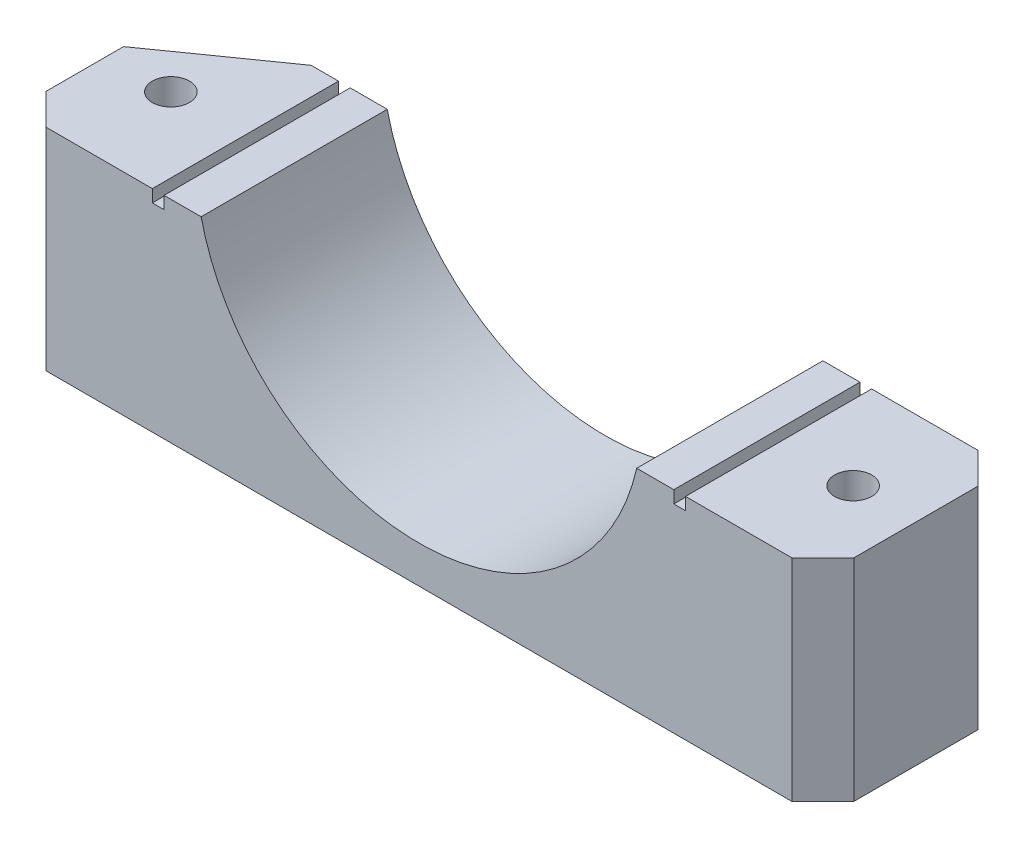
ISO-10303-21;
HEADER;
FILE_DESCRIPTION(('STEP AP214'),'2;1');
FILE_NAME('part.step','',(''),(''),'','','');
FILE_SCHEMA(('AUTOMOTIVE_DESIGN { 1 0 10303 214 1 1 1 1 }'));
ENDSEC;
DATA;
#1=APPLICATION_CONTEXT('core data for automotive mechanical design processes');
#2=APPLICATION_PROTOCOL_DEFINITION('international standard','automotive_design',2000,#1);
#3=PRODUCT_CONTEXT('',#1,'mechanical');
#4=PRODUCT('Part','Part','',(#3));
#5=PRODUCT_RELATED_PRODUCT_CATEGORY('part','',(#4));
#6=PRODUCT_DEFINITION_FORMATION('','',#4);
#7=PRODUCT_DEFINITION_CONTEXT('part definition',#1,'design');
#8=PRODUCT_DEFINITION('design','',#6,#7);
#9=PRODUCT_DEFINITION_SHAPE('','',#8);
#10=(LENGTH_UNIT() NAMED_UNIT(*) SI_UNIT(.MILLI.,.METRE.));
#11=(NAMED_UNIT(*) PLANE_ANGLE_UNIT() SI_UNIT($,.RADIAN.));
#12=(NAMED_UNIT(*) SI_UNIT($,.STERADIAN.) SOLID_ANGLE_UNIT());
#13=UNCERTAINTY_MEASURE_WITH_UNIT(LENGTH_MEASURE(1.E-05),#10,'distance_accuracy_value','');
#14=(GEOMETRIC_REPRESENTATION_CONTEXT(3) GLOBAL_UNCERTAINTY_ASSIGNED_CONTEXT((#13)) GLOBAL_UNIT_ASSIGNED_CONTEXT((#10,
#11,#12)) REPRESENTATION_CONTEXT('',''));
#15=CARTESIAN_POINT('',(0.,0.,0.));
#16=DIRECTION('',(0.,0.,1.));
#17=DIRECTION('',(1.,0.,0.));
#18=AXIS2_PLACEMENT_3D('',#15,#16,#17);
#19=CARTESIAN_POINT('',(32.5499287747842,-4.,15.));
#20=DIRECTION('',(0.,-1.,0.));
#21=DIRECTION('',(1.,0.,0.));
#22=AXIS2_PLACEMENT_3D('',#19,#20,#21);
#23=PLANE('',#22);
#24=CARTESIAN_POINT('',(27.4886444805463,-4.,7.50000000000003));
#25=DIRECTION('',(0.,1.,0.));
#26=DIRECTION('',(-1.,0.,0.));
#27=AXIS2_PLACEMENT_3D('',#24,#25,#26);
#28=CIRCLE('',#27,1.5);
#29=CARTESIAN_POINT('',(25.9886444805463,-4.,7.50000000000003));
#30=VERTEX_POINT('',#29);
#31=EDGE_CURVE('E294',#30,#30,#28,.T.);
#32=ORIENTED_EDGE('',*,*,#31,.F.);
#33=EDGE_LOOP('',(#32));
#34=FACE_BOUND('',#33,.T.);
#35=DIRECTION('',(0.,0.,1.));
#36=VECTOR('',#35,1.);
#37=CARTESIAN_POINT('',(21.4797362047984,-4.,0.));
#38=LINE('',#37,#36);
#39=CARTESIAN_POINT('',(21.4797362047984,-4.,0.));
#40=VERTEX_POINT('',#39);
#41=CARTESIAN_POINT('',(21.4797362047984,-4.,15.));
#42=VERTEX_POINT('',#41);
#43=EDGE_CURVE('E408',#40,#42,#38,.T.);
#44=ORIENTED_EDGE('',*,*,#43,.T.);
#45=DIRECTION('',(-1.,0.,0.));
#46=VECTOR('',#45,1.);
#47=CARTESIAN_POINT('',(32.5499287747842,-4.,15.));
#48=LINE('',#47,#46);
#49=CARTESIAN_POINT('',(30.0499287747842,-4.,15.));
#50=VERTEX_POINT('',#49);
#51=EDGE_CURVE('E192',#50,#42,#48,.T.);
#52=ORIENTED_EDGE('',*,*,#51,.F.);
#53=DIRECTION('',(0.707106781186548,0.,-0.707106781186548));
#54=VECTOR('',#53,1.);
#55=CARTESIAN_POINT('',(30.0499287747842,-4.,15.));
#56=LINE('',#55,#54);
#57=CARTESIAN_POINT('',(32.5499287747842,-4.,12.5));
#58=VERTEX_POINT('',#57);
#59=EDGE_CURVE('E220',#50,#58,#56,.T.);
#60=ORIENTED_EDGE('',*,*,#59,.T.);
#61=DIRECTION('',(0.,0.,-1.));
#62=VECTOR('',#61,1.);
#63=CARTESIAN_POINT('',(32.5499287747842,-4.,15.));
#64=LINE('',#63,#62);
#65=CARTESIAN_POINT('',(32.5499287747842,-4.,2.5));
#66=VERTEX_POINT('',#65);
#67=EDGE_CURVE('E212',#58,#66,#64,.T.);
#68=ORIENTED_EDGE('',*,*,#67,.T.);
#69=DIRECTION('',(0.707106781186548,0.,0.707106781186547));
#70=VECTOR('',#69,1.);
#71=CARTESIAN_POINT('',(32.5499287747842,-4.,2.5));
#72=LINE('',#71,#70);
#73=CARTESIAN_POINT('',(30.0499287747842,-4.,0.));
#74=VERTEX_POINT('',#73);
#75=EDGE_CURVE('E222',#66,#74,#72,.F.);
#76=ORIENTED_EDGE('',*,*,#75,.T.);
#77=DIRECTION('',(-1.,0.,0.));
#78=VECTOR('',#77,1.);
#79=CARTESIAN_POINT('',(32.5499287747842,-4.,0.));
#80=LINE('',#79,#78);
#81=EDGE_CURVE('E264',#74,#40,#80,.T.);
#82=ORIENTED_EDGE('',*,*,#81,.T.);
#83=EDGE_LOOP('',(#44,#52,#60,#68,#76,#82));
#84=FACE_BOUND('',#83,.T.);
#85=ADVANCED_FACE('F45',(#34,#84),#23,.F.);
#86=CARTESIAN_POINT('',(-17.5499287747842,-4.,15.));
#87=DIRECTION('',(0.,-1.,0.));
#88=DIRECTION('',(1.,0.,0.));
#89=AXIS2_PLACEMENT_3D('',#86,#87,#88);
#90=PLANE('',#89);
#91=DIRECTION('',(0.,0.,1.));
#92=VECTOR('',#91,1.);
#93=CARTESIAN_POINT('',(-20.5370518572524,-4.,0.));
#94=LINE('',#93,#92);
#95=CARTESIAN_POINT('',(-20.5370518572524,-4.,0.));
#96=VERTEX_POINT('',#95);
#97=CARTESIAN_POINT('',(-20.5370518572524,-4.,15.));
#98=VERTEX_POINT('',#97);
#99=EDGE_CURVE('E326',#96,#98,#94,.T.);
#100=ORIENTED_EDGE('',*,*,#99,.T.);
#101=DIRECTION('',(-1.,0.,0.));
#102=VECTOR('',#101,1.);
#103=CARTESIAN_POINT('',(-17.5499287747842,-4.,15.));
#104=LINE('',#103,#102);
#105=CARTESIAN_POINT('',(-17.5499287747842,-4.,15.));
#106=VERTEX_POINT('',#105);
#107=EDGE_CURVE('E258',#106,#98,#104,.T.);
#108=ORIENTED_EDGE('',*,*,#107,.F.);
#109=DIRECTION('',(0.,0.,-1.));
#110=VECTOR('',#109,1.);
#111=CARTESIAN_POINT('',(-17.5499287747842,-4.,15.));
#112=LINE('',#111,#110);
#113=CARTESIAN_POINT('',(-17.5499287747842,-4.,0.));
#114=VERTEX_POINT('',#113);
#115=EDGE_CURVE('E207',#106,#114,#112,.T.);
#116=ORIENTED_EDGE('',*,*,#115,.T.);
#117=DIRECTION('',(-1.,0.,0.));
#118=VECTOR('',#117,1.);
#119=CARTESIAN_POINT('',(-17.5499287747842,-4.,0.));
#120=LINE('',#119,#118);
#121=EDGE_CURVE('E190',#114,#96,#120,.T.);
#122=ORIENTED_EDGE('',*,*,#121,.T.);
#123=EDGE_LOOP('',(#100,#108,#116,#122));
#124=FACE_BOUND('',#123,.T.);
#125=ADVANCED_FACE('F351',(#124),#90,.F.);
#126=CARTESIAN_POINT('',(32.5499287747842,-21.,15.));
#127=DIRECTION('',(-1.,0.,0.));
#128=DIRECTION('',(0.,0.,1.));
#129=AXIS2_PLACEMENT_3D('',#126,#127,#128);
#130=PLANE('',#129);
#131=DIRECTION('',(0.,0.,-1.));
#132=VECTOR('',#131,1.);
#133=CARTESIAN_POINT('',(32.5499287747842,-21.,15.));
#134=LINE('',#133,#132);
#135=CARTESIAN_POINT('',(32.5499287747842,-21.,12.5));
#136=VERTEX_POINT('',#135);
#137=CARTESIAN_POINT('',(32.5499287747842,-21.,2.5));
#138=VERTEX_POINT('',#137);
#139=EDGE_CURVE('E199',#136,#138,#134,.T.);
#140=ORIENTED_EDGE('',*,*,#139,.T.);
#141=DIRECTION('',(0.,1.,0.));
#142=VECTOR('',#141,1.);
#143=CARTESIAN_POINT('',(32.5499287747842,-21.,2.5));
#144=LINE('',#143,#142);
#145=EDGE_CURVE('E217',#138,#66,#144,.T.);
#146=ORIENTED_EDGE('',*,*,#145,.T.);
#147=ORIENTED_EDGE('',*,*,#67,.F.);
#148=DIRECTION('',(0.,-1.,0.));
#149=VECTOR('',#148,1.);
#150=CARTESIAN_POINT('',(32.5499287747842,-21.,12.5));
#151=LINE('',#150,#149);
#152=EDGE_CURVE('E215',#58,#136,#151,.T.);
#153=ORIENTED_EDGE('',*,*,#152,.T.);
#154=EDGE_LOOP('',(#140,#146,#147,#153));
#155=FACE_BOUND('',#154,.T.);
#156=ADVANCED_FACE('F353',(#155),#130,.F.);
#157=CARTESIAN_POINT('',(20.5370518572524,-4.,15.));
#158=VERTEX_POINT('',#157);
#159=CARTESIAN_POINT('',(17.5499287747842,-4.,15.));
#160=VERTEX_POINT('',#159);
#161=EDGE_CURVE('E189',#158,#160,#48,.T.);
#162=ORIENTED_EDGE('',*,*,#161,.F.);
#163=DIRECTION('',(0.,0.,1.));
#164=VECTOR('',#163,1.);
#165=CARTESIAN_POINT('',(20.5370518572524,-4.,0.));
#166=LINE('',#165,#164);
#167=CARTESIAN_POINT('',(20.5370518572524,-4.,0.));
#168=VERTEX_POINT('',#167);
#169=EDGE_CURVE('E316',#168,#158,#166,.T.);
#170=ORIENTED_EDGE('',*,*,#169,.F.);
#171=CARTESIAN_POINT('',(17.5499287747842,-4.,0.));
#172=VERTEX_POINT('',#171);
#173=EDGE_CURVE('E267',#168,#172,#80,.T.);
#174=ORIENTED_EDGE('',*,*,#173,.T.);
#175=DIRECTION('',(0.,0.,-1.));
#176=VECTOR('',#175,1.);
#177=CARTESIAN_POINT('',(17.5499287747842,-4.,15.));
#178=LINE('',#177,#176);
#179=EDGE_CURVE('E209',#160,#172,#178,.T.);
#180=ORIENTED_EDGE('',*,*,#179,.F.);
#181=EDGE_LOOP('',(#162,#170,#174,#180));
#182=FACE_BOUND('',#181,.T.);
#183=ADVANCED_FACE('F315',(#182),#23,.F.);
#184=CARTESIAN_POINT('',(0.,0.,15.));
#185=DIRECTION('',(0.,0.,-1.));
#186=DIRECTION('',(-1.,0.,0.));
#187=AXIS2_PLACEMENT_3D('',#184,#185,#186);
#188=CYLINDRICAL_SURFACE('',#187,18.);
#189=CARTESIAN_POINT('',(0.,0.,0.));
#190=DIRECTION('',(0.,0.,1.));
#191=DIRECTION('',(1.,0.,0.));
#192=AXIS2_PLACEMENT_3D('',#189,#190,#191);
#193=CIRCLE('',#192,18.);
#194=EDGE_CURVE('E266',#114,#172,#193,.T.);
#195=ORIENTED_EDGE('',*,*,#194,.F.);
#196=ORIENTED_EDGE('',*,*,#115,.F.);
#197=CARTESIAN_POINT('',(0.,0.,15.));
#198=DIRECTION('',(0.,0.,1.));
#199=DIRECTION('',(1.,0.,0.));
#200=AXIS2_PLACEMENT_3D('',#197,#198,#199);
#201=CIRCLE('',#200,18.);
#202=EDGE_CURVE('E302',#106,#160,#201,.T.);
#203=ORIENTED_EDGE('',*,*,#202,.T.);
#204=ORIENTED_EDGE('',*,*,#179,.T.);
#205=EDGE_LOOP('',(#195,#196,#203,#204));
#206=FACE_BOUND('',#205,.T.);
#207=ADVANCED_FACE('F306',(#206),#188,.F.);
#208=CARTESIAN_POINT('',(-27.4886444805463,-4.00000000000002,7.50000000000003));
#209=DIRECTION('',(0.,1.,0.));
#210=DIRECTION('',(1.,0.,0.));
#211=AXIS2_PLACEMENT_3D('',#208,#209,#210);
#212=CIRCLE('',#211,1.5);
#213=CARTESIAN_POINT('',(-25.9886444805463,-4.00000000000002,7.50000000000003));
#214=VERTEX_POINT('',#213);
#215=EDGE_CURVE('E297',#214,#214,#212,.T.);
#216=ORIENTED_EDGE('',*,*,#215,.F.);
#217=EDGE_LOOP('',(#216));
#218=FACE_BOUND('',#217,.T.);
#219=CARTESIAN_POINT('',(-21.4797362047984,-4.,0.));
#220=VERTEX_POINT('',#219);
#221=CARTESIAN_POINT('',(-23.6830969203936,-4.,0.));
#222=VERTEX_POINT('',#221);
#223=EDGE_CURVE('E195',#220,#222,#120,.T.);
#224=ORIENTED_EDGE('',*,*,#223,.T.);
#225=DIRECTION('',(-0.817355943758289,0.,0.576133023878164));
#226=VECTOR('',#225,1.);
#227=CARTESIAN_POINT('',(-26.6492930181239,-4.,2.09079476359242));
#228=LINE('',#227,#226);
#229=CARTESIAN_POINT('',(-32.5499287747842,-4.,6.25));
#230=VERTEX_POINT('',#229);
#231=EDGE_CURVE('E61',#222,#230,#228,.T.);
#232=ORIENTED_EDGE('',*,*,#231,.T.);
#233=DIRECTION('',(0.,0.,-1.));
#234=VECTOR('',#233,1.);
#235=CARTESIAN_POINT('',(-32.5499287747842,-4.,15.));
#236=LINE('',#235,#234);
#237=CARTESIAN_POINT('',(-32.5499287747842,-4.,12.5));
#238=VERTEX_POINT('',#237);
#239=EDGE_CURVE('E204',#238,#230,#236,.T.);
#240=ORIENTED_EDGE('',*,*,#239,.F.);
#241=DIRECTION('',(0.707106781186548,0.,0.707106781186548));
#242=VECTOR('',#241,1.);
#243=CARTESIAN_POINT('',(-30.0499287747842,-4.,15.));
#244=LINE('',#243,#242);
#245=CARTESIAN_POINT('',(-30.0499287747842,-4.,15.));
#246=VERTEX_POINT('',#245);
#247=EDGE_CURVE('E54',#238,#246,#244,.T.);
#248=ORIENTED_EDGE('',*,*,#247,.T.);
#249=CARTESIAN_POINT('',(-21.4797362047984,-4.,15.));
#250=VERTEX_POINT('',#249);
#251=EDGE_CURVE('E246',#250,#246,#104,.T.);
#252=ORIENTED_EDGE('',*,*,#251,.F.);
#253=DIRECTION('',(0.,0.,1.));
#254=VECTOR('',#253,1.);
#255=CARTESIAN_POINT('',(-21.4797362047984,-4.,0.));
#256=LINE('',#255,#254);
#257=EDGE_CURVE('E272',#220,#250,#256,.T.);
#258=ORIENTED_EDGE('',*,*,#257,.F.);
#259=EDGE_LOOP('',(#224,#232,#240,#248,#252,#258));
#260=FACE_BOUND('',#259,.T.);
#261=ADVANCED_FACE('F244',(#218,#260),#90,.F.);
#262=CARTESIAN_POINT('',(-32.5499287747842,-4.,15.));
#263=DIRECTION('',(1.,0.,0.));
#264=DIRECTION('',(0.,0.,-1.));
#265=AXIS2_PLACEMENT_3D('',#262,#263,#264);
#266=PLANE('',#265);
#267=ORIENTED_EDGE('',*,*,#239,.T.);
#268=DIRECTION('',(0.,-1.,0.));
#269=VECTOR('',#268,1.);
#270=CARTESIAN_POINT('',(-32.5499287747842,3.99999999999999,6.25));
#271=LINE('',#270,#269);
#272=CARTESIAN_POINT('',(-32.5499287747842,-21.,6.25));
#273=VERTEX_POINT('',#272);
#274=EDGE_CURVE('E182',#230,#273,#271,.T.);
#275=ORIENTED_EDGE('',*,*,#274,.T.);
#276=DIRECTION('',(0.,0.,-1.));
#277=VECTOR('',#276,1.);
#278=CARTESIAN_POINT('',(-32.5499287747842,-21.,15.));
#279=LINE('',#278,#277);
#280=CARTESIAN_POINT('',(-32.5499287747842,-21.,12.5));
#281=VERTEX_POINT('',#280);
#282=EDGE_CURVE('E181',#281,#273,#279,.T.);
#283=ORIENTED_EDGE('',*,*,#282,.F.);
#284=DIRECTION('',(0.,1.,0.));
#285=VECTOR('',#284,1.);
#286=CARTESIAN_POINT('',(-32.5499287747842,-4.,12.5));
#287=LINE('',#286,#285);
#288=EDGE_CURVE('E237',#281,#238,#287,.T.);
#289=ORIENTED_EDGE('',*,*,#288,.T.);
#290=EDGE_LOOP('',(#267,#275,#283,#289));
#291=FACE_BOUND('',#290,.T.);
#292=ADVANCED_FACE('F368',(#291),#266,.F.);
#293=CARTESIAN_POINT('',(-32.5499287747842,-21.,15.));
#294=DIRECTION('',(0.,1.,0.));
#295=DIRECTION('',(0.,0.,1.));
#296=AXIS2_PLACEMENT_3D('',#293,#294,#295);
#297=PLANE('',#296);
#298=CARTESIAN_POINT('',(27.4886444805463,-21.,7.50000000000003));
#299=DIRECTION('',(0.,1.,0.));
#300=DIRECTION('',(-1.,0.,0.));
#301=AXIS2_PLACEMENT_3D('',#298,#299,#300);
#302=CIRCLE('',#301,1.5);
#303=CARTESIAN_POINT('',(25.9886444805463,-21.,7.50000000000003));
#304=VERTEX_POINT('',#303);
#305=EDGE_CURVE('E291',#304,#304,#302,.T.);
#306=ORIENTED_EDGE('',*,*,#305,.T.);
#307=EDGE_LOOP('',(#306));
#308=FACE_BOUND('',#307,.T.);
#309=CARTESIAN_POINT('',(-27.4886444805463,-21.,7.50000000000003));
#310=DIRECTION('',(0.,1.,0.));
#311=DIRECTION('',(1.,0.,0.));
#312=AXIS2_PLACEMENT_3D('',#309,#310,#311);
#313=CIRCLE('',#312,1.5);
#314=CARTESIAN_POINT('',(-25.9886444805463,-21.,7.50000000000003));
#315=VERTEX_POINT('',#314);
#316=EDGE_CURVE('E283',#315,#315,#313,.T.);
#317=ORIENTED_EDGE('',*,*,#316,.T.);
#318=EDGE_LOOP('',(#317));
#319=FACE_BOUND('',#318,.T.);
#320=ORIENTED_EDGE('',*,*,#282,.T.);
#321=DIRECTION('',(-0.817355943758289,0.,0.576133023878164));
#322=VECTOR('',#321,1.);
#323=CARTESIAN_POINT('',(-23.6830969203936,-21.,0.));
#324=LINE('',#323,#322);
#325=CARTESIAN_POINT('',(-23.6830969203936,-21.,0.));
#326=VERTEX_POINT('',#325);
#327=EDGE_CURVE('E169',#326,#273,#324,.T.);
#328=ORIENTED_EDGE('',*,*,#327,.F.);
#329=DIRECTION('',(1.,0.,0.));
#330=VECTOR('',#329,1.);
#331=CARTESIAN_POINT('',(-32.5499287747842,-21.,0.));
#332=LINE('',#331,#330);
#333=CARTESIAN_POINT('',(30.0499287747842,-21.,0.));
#334=VERTEX_POINT('',#333);
#335=EDGE_CURVE('E178',#326,#334,#332,.T.);
#336=ORIENTED_EDGE('',*,*,#335,.T.);
#337=DIRECTION('',(-0.707106781186548,0.,-0.707106781186547));
#338=VECTOR('',#337,1.);
#339=CARTESIAN_POINT('',(32.5499287747842,-21.,2.5));
#340=LINE('',#339,#338);
#341=EDGE_CURVE('E229',#334,#138,#340,.F.);
#342=ORIENTED_EDGE('',*,*,#341,.T.);
#343=ORIENTED_EDGE('',*,*,#139,.F.);
#344=DIRECTION('',(-0.707106781186548,0.,0.707106781186548));
#345=VECTOR('',#344,1.);
#346=CARTESIAN_POINT('',(30.0499287747842,-21.,15.));
#347=LINE('',#346,#345);
#348=CARTESIAN_POINT('',(30.0499287747842,-21.,15.));
#349=VERTEX_POINT('',#348);
#350=EDGE_CURVE('E227',#136,#349,#347,.T.);
#351=ORIENTED_EDGE('',*,*,#350,.T.);
#352=DIRECTION('',(1.,0.,0.));
#353=VECTOR('',#352,1.);
#354=CARTESIAN_POINT('',(-32.5499287747842,-21.,15.));
#355=LINE('',#354,#353);
#356=CARTESIAN_POINT('',(-30.0499287747842,-21.,15.));
#357=VERTEX_POINT('',#356);
#358=EDGE_CURVE('E202',#357,#349,#355,.T.);
#359=ORIENTED_EDGE('',*,*,#358,.F.);
#360=DIRECTION('',(-0.707106781186548,0.,-0.707106781186548));
#361=VECTOR('',#360,1.);
#362=CARTESIAN_POINT('',(-30.0499287747842,-21.,15.));
#363=LINE('',#362,#361);
#364=EDGE_CURVE('E225',#357,#281,#363,.T.);
#365=ORIENTED_EDGE('',*,*,#364,.T.);
#366=EDGE_LOOP('',(#320,#328,#336,#342,#343,#351,#359,#365));
#367=FACE_BOUND('',#366,.T.);
#368=ADVANCED_FACE('F177',(#308,#319,#367),#297,.F.);
#369=CARTESIAN_POINT('',(0.,0.,15.));
#370=DIRECTION('',(0.,0.,1.));
#371=DIRECTION('',(1.,0.,0.));
#372=AXIS2_PLACEMENT_3D('',#369,#370,#371);
#373=PLANE('',#372);
#374=DIRECTION('',(0.,1.,0.));
#375=VECTOR('',#374,1.);
#376=CARTESIAN_POINT('',(20.5370518572524,-5.,15.));
#377=LINE('',#376,#375);
#378=CARTESIAN_POINT('',(20.5370518572524,-5.,15.));
#379=VERTEX_POINT('',#378);
#380=EDGE_CURVE('E312',#379,#158,#377,.T.);
#381=ORIENTED_EDGE('',*,*,#380,.T.);
#382=ORIENTED_EDGE('',*,*,#161,.T.);
#383=ORIENTED_EDGE('',*,*,#202,.F.);
#384=ORIENTED_EDGE('',*,*,#107,.T.);
#385=DIRECTION('',(0.,1.,0.));
#386=VECTOR('',#385,1.);
#387=CARTESIAN_POINT('',(-20.5370518572524,-5.,15.));
#388=LINE('',#387,#386);
#389=CARTESIAN_POINT('',(-20.5370518572524,-5.,15.));
#390=VERTEX_POINT('',#389);
#391=EDGE_CURVE('E285',#390,#98,#388,.T.);
#392=ORIENTED_EDGE('',*,*,#391,.F.);
#393=DIRECTION('',(1.,0.,0.));
#394=VECTOR('',#393,1.);
#395=CARTESIAN_POINT('',(-21.4797362047984,-5.,15.));
#396=LINE('',#395,#394);
#397=CARTESIAN_POINT('',(-21.4797362047984,-5.,15.));
#398=VERTEX_POINT('',#397);
#399=EDGE_CURVE('E334',#398,#390,#396,.T.);
#400=ORIENTED_EDGE('',*,*,#399,.F.);
#401=DIRECTION('',(0.,1.,0.));
#402=VECTOR('',#401,1.);
#403=CARTESIAN_POINT('',(-21.4797362047984,-5.,15.));
#404=LINE('',#403,#402);
#405=EDGE_CURVE('E280',#398,#250,#404,.T.);
#406=ORIENTED_EDGE('',*,*,#405,.T.);
#407=ORIENTED_EDGE('',*,*,#251,.T.);
#408=DIRECTION('',(0.,-1.,0.));
#409=VECTOR('',#408,1.);
#410=CARTESIAN_POINT('',(-30.0499287747842,-21.,15.));
#411=LINE('',#410,#409);
#412=EDGE_CURVE('E231',#246,#357,#411,.T.);
#413=ORIENTED_EDGE('',*,*,#412,.T.);
#414=ORIENTED_EDGE('',*,*,#358,.T.);
#415=DIRECTION('',(0.,1.,0.));
#416=VECTOR('',#415,1.);
#417=CARTESIAN_POINT('',(30.0499287747842,-4.,15.));
#418=LINE('',#417,#416);
#419=EDGE_CURVE('E234',#349,#50,#418,.T.);
#420=ORIENTED_EDGE('',*,*,#419,.T.);
#421=ORIENTED_EDGE('',*,*,#51,.T.);
#422=DIRECTION('',(0.,1.,0.));
#423=VECTOR('',#422,1.);
#424=CARTESIAN_POINT('',(21.4797362047984,-5.,15.));
#425=LINE('',#424,#423);
#426=CARTESIAN_POINT('',(21.4797362047984,-5.,15.));
#427=VERTEX_POINT('',#426);
#428=EDGE_CURVE('E328',#427,#42,#425,.T.);
#429=ORIENTED_EDGE('',*,*,#428,.F.);
#430=DIRECTION('',(-1.,0.,0.));
#431=VECTOR('',#430,1.);
#432=CARTESIAN_POINT('',(21.4797362047984,-5.,15.));
#433=LINE('',#432,#431);
#434=EDGE_CURVE('E418',#427,#379,#433,.T.);
#435=ORIENTED_EDGE('',*,*,#434,.T.);
#436=EDGE_LOOP('',(#381,#382,#383,#384,#392,#400,#406,#407,#413,#414,#420,#421,#429,#435));
#437=FACE_BOUND('',#436,.T.);
#438=ADVANCED_FACE('F253',(#437),#373,.T.);
#439=CARTESIAN_POINT('',(0.,0.,0.));
#440=DIRECTION('',(0.,0.,1.));
#441=DIRECTION('',(1.,0.,0.));
#442=AXIS2_PLACEMENT_3D('',#439,#440,#441);
#443=PLANE('',#442);
#444=ORIENTED_EDGE('',*,*,#335,.F.);
#445=DIRECTION('',(0.,1.,0.));
#446=VECTOR('',#445,1.);
#447=CARTESIAN_POINT('',(-23.6830969203936,0.,0.));
#448=LINE('',#447,#446);
#449=EDGE_CURVE('E11',#326,#222,#448,.T.);
#450=ORIENTED_EDGE('',*,*,#449,.T.);
#451=ORIENTED_EDGE('',*,*,#223,.F.);
#452=DIRECTION('',(0.,1.,0.));
#453=VECTOR('',#452,1.);
#454=CARTESIAN_POINT('',(-21.4797362047984,-5.,0.));
#455=LINE('',#454,#453);
#456=CARTESIAN_POINT('',(-21.4797362047984,-5.,0.));
#457=VERTEX_POINT('',#456);
#458=EDGE_CURVE('E275',#457,#220,#455,.T.);
#459=ORIENTED_EDGE('',*,*,#458,.F.);
#460=DIRECTION('',(1.,0.,0.));
#461=VECTOR('',#460,1.);
#462=CARTESIAN_POINT('',(-21.4797362047984,-5.,0.));
#463=LINE('',#462,#461);
#464=CARTESIAN_POINT('',(-20.5370518572524,-5.,0.));
#465=VERTEX_POINT('',#464);
#466=EDGE_CURVE('E277',#457,#465,#463,.T.);
#467=ORIENTED_EDGE('',*,*,#466,.T.);
#468=DIRECTION('',(0.,1.,0.));
#469=VECTOR('',#468,1.);
#470=CARTESIAN_POINT('',(-20.5370518572524,-5.,0.));
#471=LINE('',#470,#469);
#472=EDGE_CURVE('E281',#465,#96,#471,.T.);
#473=ORIENTED_EDGE('',*,*,#472,.T.);
#474=ORIENTED_EDGE('',*,*,#121,.F.);
#475=ORIENTED_EDGE('',*,*,#194,.T.);
#476=ORIENTED_EDGE('',*,*,#173,.F.);
#477=DIRECTION('',(0.,1.,0.));
#478=VECTOR('',#477,1.);
#479=CARTESIAN_POINT('',(20.5370518572524,-5.,0.));
#480=LINE('',#479,#478);
#481=CARTESIAN_POINT('',(20.5370518572524,-5.,0.));
#482=VERTEX_POINT('',#481);
#483=EDGE_CURVE('E319',#482,#168,#480,.T.);
#484=ORIENTED_EDGE('',*,*,#483,.F.);
#485=DIRECTION('',(-1.,0.,0.));
#486=VECTOR('',#485,1.);
#487=CARTESIAN_POINT('',(21.4797362047984,-5.,0.));
#488=LINE('',#487,#486);
#489=CARTESIAN_POINT('',(21.4797362047984,-5.,0.));
#490=VERTEX_POINT('',#489);
#491=EDGE_CURVE('E321',#490,#482,#488,.T.);
#492=ORIENTED_EDGE('',*,*,#491,.F.);
#493=DIRECTION('',(0.,1.,0.));
#494=VECTOR('',#493,1.);
#495=CARTESIAN_POINT('',(21.4797362047984,-5.,0.));
#496=LINE('',#495,#494);
#497=EDGE_CURVE('E324',#490,#40,#496,.T.);
#498=ORIENTED_EDGE('',*,*,#497,.T.);
#499=ORIENTED_EDGE('',*,*,#81,.F.);
#500=DIRECTION('',(0.,-1.,0.));
#501=VECTOR('',#500,1.);
#502=CARTESIAN_POINT('',(30.0499287747842,0.,0.));
#503=LINE('',#502,#501);
#504=EDGE_CURVE('E187',#74,#334,#503,.T.);
#505=ORIENTED_EDGE('',*,*,#504,.T.);
#506=EDGE_LOOP('',(#444,#450,#451,#459,#467,#473,#474,#475,#476,#484,#492,#498,#499,#505));
#507=FACE_BOUND('',#506,.T.);
#508=ADVANCED_FACE('F184',(#507),#443,.F.);
#509=CARTESIAN_POINT('',(32.5499287747842,-21.,2.5));
#510=DIRECTION('',(-0.707106781186547,0.,0.707106781186548));
#511=DIRECTION('',(0.,1.,0.));
#512=AXIS2_PLACEMENT_3D('',#509,#510,#511);
#513=PLANE('',#512);
#514=ORIENTED_EDGE('',*,*,#341,.F.);
#515=ORIENTED_EDGE('',*,*,#504,.F.);
#516=ORIENTED_EDGE('',*,*,#75,.F.);
#517=ORIENTED_EDGE('',*,*,#145,.F.);
#518=EDGE_LOOP('',(#514,#515,#516,#517));
#519=FACE_BOUND('',#518,.T.);
#520=ADVANCED_FACE('F396',(#519),#513,.F.);
#521=CARTESIAN_POINT('',(30.0499287747842,0.,15.));
#522=DIRECTION('',(0.707106781186547,0.,0.707106781186547));
#523=DIRECTION('',(0.,-1.,0.));
#524=AXIS2_PLACEMENT_3D('',#521,#522,#523);
#525=PLANE('',#524);
#526=ORIENTED_EDGE('',*,*,#350,.F.);
#527=ORIENTED_EDGE('',*,*,#152,.F.);
#528=ORIENTED_EDGE('',*,*,#59,.F.);
#529=ORIENTED_EDGE('',*,*,#419,.F.);
#530=EDGE_LOOP('',(#526,#527,#528,#529));
#531=FACE_BOUND('',#530,.T.);
#532=ADVANCED_FACE('F388',(#531),#525,.T.);
#533=CARTESIAN_POINT('',(-30.0499287747842,0.,15.));
#534=DIRECTION('',(-0.707106781186547,0.,0.707106781186547));
#535=DIRECTION('',(0.,1.,0.));
#536=AXIS2_PLACEMENT_3D('',#533,#534,#535);
#537=PLANE('',#536);
#538=ORIENTED_EDGE('',*,*,#247,.F.);
#539=ORIENTED_EDGE('',*,*,#288,.F.);
#540=ORIENTED_EDGE('',*,*,#364,.F.);
#541=ORIENTED_EDGE('',*,*,#412,.F.);
#542=EDGE_LOOP('',(#538,#539,#540,#541));
#543=FACE_BOUND('',#542,.T.);
#544=ADVANCED_FACE('F48',(#543),#537,.T.);
#545=CARTESIAN_POINT('',(-27.4886444805463,-21.,7.50000000000003));
#546=DIRECTION('',(0.,1.,0.));
#547=DIRECTION('',(-1.,0.,0.));
#548=AXIS2_PLACEMENT_3D('',#545,#546,#547);
#549=CYLINDRICAL_SURFACE('',#548,1.5);
#550=ORIENTED_EDGE('',*,*,#316,.F.);
#551=EDGE_LOOP('',(#550));
#552=FACE_BOUND('',#551,.T.);
#553=ORIENTED_EDGE('',*,*,#215,.T.);
#554=EDGE_LOOP('',(#553));
#555=FACE_BOUND('',#554,.T.);
#556=ADVANCED_FACE('F378',(#552,#555),#549,.F.);
#557=CARTESIAN_POINT('',(27.4886444805463,-21.,7.50000000000003));
#558=DIRECTION('',(0.,1.,0.));
#559=DIRECTION('',(-1.,0.,0.));
#560=AXIS2_PLACEMENT_3D('',#557,#558,#559);
#561=CYLINDRICAL_SURFACE('',#560,1.5);
#562=ORIENTED_EDGE('',*,*,#305,.F.);
#563=EDGE_LOOP('',(#562));
#564=FACE_BOUND('',#563,.T.);
#565=ORIENTED_EDGE('',*,*,#31,.T.);
#566=EDGE_LOOP('',(#565));
#567=FACE_BOUND('',#566,.T.);
#568=ADVANCED_FACE('F380',(#564,#567),#561,.F.);
#569=CARTESIAN_POINT('',(-21.4797362047984,-5.,0.));
#570=DIRECTION('',(-1.,0.,0.));
#571=DIRECTION('',(0.,-1.,0.));
#572=AXIS2_PLACEMENT_3D('',#569,#570,#571);
#573=PLANE('',#572);
#574=ORIENTED_EDGE('',*,*,#257,.T.);
#575=ORIENTED_EDGE('',*,*,#405,.F.);
#576=DIRECTION('',(0.,0.,1.));
#577=VECTOR('',#576,1.);
#578=CARTESIAN_POINT('',(-21.4797362047984,-5.,0.));
#579=LINE('',#578,#577);
#580=EDGE_CURVE('E290',#457,#398,#579,.T.);
#581=ORIENTED_EDGE('',*,*,#580,.F.);
#582=ORIENTED_EDGE('',*,*,#458,.T.);
#583=EDGE_LOOP('',(#574,#575,#581,#582));
#584=FACE_BOUND('',#583,.T.);
#585=ADVANCED_FACE('F343',(#584),#573,.F.);
#586=CARTESIAN_POINT('',(-20.5370518572524,-5.,0.));
#587=DIRECTION('',(-1.,0.,0.));
#588=DIRECTION('',(0.,-1.,0.));
#589=AXIS2_PLACEMENT_3D('',#586,#587,#588);
#590=PLANE('',#589);
#591=ORIENTED_EDGE('',*,*,#99,.F.);
#592=ORIENTED_EDGE('',*,*,#472,.F.);
#593=DIRECTION('',(0.,0.,1.));
#594=VECTOR('',#593,1.);
#595=CARTESIAN_POINT('',(-20.5370518572524,-5.,0.));
#596=LINE('',#595,#594);
#597=EDGE_CURVE('E337',#465,#390,#596,.T.);
#598=ORIENTED_EDGE('',*,*,#597,.T.);
#599=ORIENTED_EDGE('',*,*,#391,.T.);
#600=EDGE_LOOP('',(#591,#592,#598,#599));
#601=FACE_BOUND('',#600,.T.);
#602=ADVANCED_FACE('F349',(#601),#590,.T.);
#603=CARTESIAN_POINT('',(0.,-5.,0.));
#604=DIRECTION('',(0.,-1.,0.));
#605=DIRECTION('',(0.,0.,-1.));
#606=AXIS2_PLACEMENT_3D('',#603,#604,#605);
#607=PLANE('',#606);
#608=ORIENTED_EDGE('',*,*,#399,.T.);
#609=ORIENTED_EDGE('',*,*,#597,.F.);
#610=ORIENTED_EDGE('',*,*,#466,.F.);
#611=ORIENTED_EDGE('',*,*,#580,.T.);
#612=EDGE_LOOP('',(#608,#609,#610,#611));
#613=FACE_BOUND('',#612,.T.);
#614=ADVANCED_FACE('F346',(#613),#607,.F.);
#615=CARTESIAN_POINT('',(20.5370518572524,-5.,0.));
#616=DIRECTION('',(-1.,0.,0.));
#617=DIRECTION('',(0.,-1.,0.));
#618=AXIS2_PLACEMENT_3D('',#615,#616,#617);
#619=PLANE('',#618);
#620=ORIENTED_EDGE('',*,*,#169,.T.);
#621=ORIENTED_EDGE('',*,*,#380,.F.);
#622=DIRECTION('',(0.,0.,1.));
#623=VECTOR('',#622,1.);
#624=CARTESIAN_POINT('',(20.5370518572524,-5.,0.));
#625=LINE('',#624,#623);
#626=EDGE_CURVE('E333',#482,#379,#625,.T.);
#627=ORIENTED_EDGE('',*,*,#626,.F.);
#628=ORIENTED_EDGE('',*,*,#483,.T.);
#629=EDGE_LOOP('',(#620,#621,#627,#628));
#630=FACE_BOUND('',#629,.T.);
#631=ADVANCED_FACE('F427',(#630),#619,.F.);
#632=CARTESIAN_POINT('',(21.4797362047984,-5.,0.));
#633=DIRECTION('',(-1.,0.,0.));
#634=DIRECTION('',(0.,-1.,0.));
#635=AXIS2_PLACEMENT_3D('',#632,#633,#634);
#636=PLANE('',#635);
#637=ORIENTED_EDGE('',*,*,#43,.F.);
#638=ORIENTED_EDGE('',*,*,#497,.F.);
#639=DIRECTION('',(0.,0.,1.));
#640=VECTOR('',#639,1.);
#641=CARTESIAN_POINT('',(21.4797362047984,-5.,0.));
#642=LINE('',#641,#640);
#643=EDGE_CURVE('E68',#490,#427,#642,.T.);
#644=ORIENTED_EDGE('',*,*,#643,.T.);
#645=ORIENTED_EDGE('',*,*,#428,.T.);
#646=EDGE_LOOP('',(#637,#638,#644,#645));
#647=FACE_BOUND('',#646,.T.);
#648=ADVANCED_FACE('F417',(#647),#636,.T.);
#649=CARTESIAN_POINT('',(0.,-5.,0.));
#650=DIRECTION('',(0.,-1.,0.));
#651=DIRECTION('',(0.,0.,-1.));
#652=AXIS2_PLACEMENT_3D('',#649,#650,#651);
#653=PLANE('',#652);
#654=ORIENTED_EDGE('',*,*,#434,.F.);
#655=ORIENTED_EDGE('',*,*,#643,.F.);
#656=ORIENTED_EDGE('',*,*,#491,.T.);
#657=ORIENTED_EDGE('',*,*,#626,.T.);
#658=EDGE_LOOP('',(#654,#655,#656,#657));
#659=FACE_BOUND('',#658,.T.);
#660=ADVANCED_FACE('F421',(#659),#653,.F.);
#661=CARTESIAN_POINT('',(-23.6830969203936,3.99999999999999,0.));
#662=DIRECTION('',(0.576133023878164,0.,0.817355943758289));
#663=DIRECTION('',(0.817355943758289,0.,-0.576133023878164));
#664=AXIS2_PLACEMENT_3D('',#661,#662,#663);
#665=PLANE('',#664);
#666=ORIENTED_EDGE('',*,*,#449,.F.);
#667=ORIENTED_EDGE('',*,*,#327,.T.);
#668=ORIENTED_EDGE('',*,*,#274,.F.);
#669=ORIENTED_EDGE('',*,*,#231,.F.);
#670=EDGE_LOOP('',(#666,#667,#668,#669));
#671=FACE_BOUND('',#670,.T.);
#672=ADVANCED_FACE('F168',(#671),#665,.F.);
#673=CLOSED_SHELL('',(#85,#125,#156,#183,#207,#261,#292,#368,#438,#508,#520,#532,#544,#556,#568,
#585,#602,#614,#631,#648,#660,#672));
#674=MANIFOLD_SOLID_BREP('B2',#673);
#675=ADVANCED_BREP_SHAPE_REPRESENTATION('',(#18,#674),#14);
#676=SHAPE_DEFINITION_REPRESENTATION(#9,#675);
ENDSEC;
END-ISO-10303-21;
